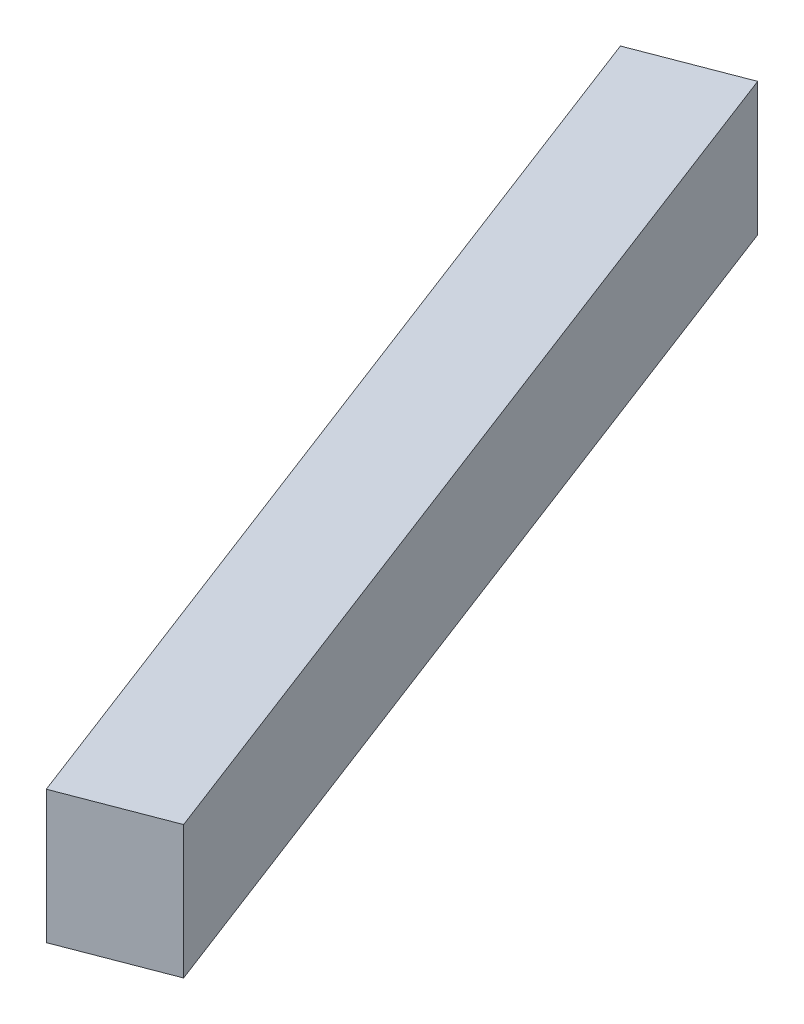
ISO-10303-21;
HEADER;
FILE_DESCRIPTION(('STEP AP214'),'2;1');
FILE_NAME('part.step','',(''),(''),'','','');
FILE_SCHEMA(('AUTOMOTIVE_DESIGN { 1 0 10303 214 1 1 1 1 }'));
ENDSEC;
DATA;
#1=APPLICATION_CONTEXT('core data for automotive mechanical design processes');
#2=APPLICATION_PROTOCOL_DEFINITION('international standard','automotive_design',2000,#1);
#3=PRODUCT_CONTEXT('',#1,'mechanical');
#4=PRODUCT('Part','Part','',(#3));
#5=PRODUCT_RELATED_PRODUCT_CATEGORY('part','',(#4));
#6=PRODUCT_DEFINITION_FORMATION('','',#4);
#7=PRODUCT_DEFINITION_CONTEXT('part definition',#1,'design');
#8=PRODUCT_DEFINITION('design','',#6,#7);
#9=PRODUCT_DEFINITION_SHAPE('','',#8);
#10=(LENGTH_UNIT() NAMED_UNIT(*) SI_UNIT(.MILLI.,.METRE.));
#11=(NAMED_UNIT(*) PLANE_ANGLE_UNIT() SI_UNIT($,.RADIAN.));
#12=(NAMED_UNIT(*) SI_UNIT($,.STERADIAN.) SOLID_ANGLE_UNIT());
#13=UNCERTAINTY_MEASURE_WITH_UNIT(LENGTH_MEASURE(1.E-05),#10,'distance_accuracy_value','');
#14=(GEOMETRIC_REPRESENTATION_CONTEXT(3) GLOBAL_UNCERTAINTY_ASSIGNED_CONTEXT((#13)) GLOBAL_UNIT_ASSIGNED_CONTEXT((#10,
#11,#12)) REPRESENTATION_CONTEXT('',''));
#15=CARTESIAN_POINT('',(0.,0.,0.));
#16=DIRECTION('',(0.,0.,1.));
#17=DIRECTION('',(1.,0.,0.));
#18=AXIS2_PLACEMENT_3D('',#15,#16,#17);
#19=CARTESIAN_POINT('',(-6.53262142412865,7.874,-16.769580594442));
#20=DIRECTION('',(0.933801248386571,0.,-0.357792158259068));
#21=DIRECTION('',(-0.357792158259068,0.,-0.933801248386571));
#22=AXIS2_PLACEMENT_3D('',#19,#20,#21);
#23=PLANE('',#22);
#24=DIRECTION('',(0.,1.,0.));
#25=VECTOR('',#24,1.);
#26=CARTESIAN_POINT('',(-6.53262142412865,7.874,-16.769580594442));
#27=LINE('',#26,#25);
#28=CARTESIAN_POINT('',(-6.53262142412865,7.62,-16.769580594442));
#29=VERTEX_POINT('',#28);
#30=CARTESIAN_POINT('',(-6.53262142412865,7.874,-16.769580594442));
#31=VERTEX_POINT('',#30);
#32=EDGE_CURVE('E20',#29,#31,#27,.T.);
#33=ORIENTED_EDGE('',*,*,#32,.T.);
#34=DIRECTION('',(-0.357792158259069,0.,-0.93380124838657));
#35=VECTOR('',#34,1.);
#36=CARTESIAN_POINT('',(-6.53262142412865,7.874,-16.769580594442));
#37=LINE('',#36,#35);
#38=CARTESIAN_POINT('',(-7.21421548561217,7.874,-18.5484719726184));
#39=VERTEX_POINT('',#38);
#40=EDGE_CURVE('E55',#31,#39,#37,.T.);
#41=ORIENTED_EDGE('',*,*,#40,.T.);
#42=DIRECTION('',(0.,1.,0.));
#43=VECTOR('',#42,1.);
#44=CARTESIAN_POINT('',(-7.21421548561217,7.874,-18.5484719726184));
#45=LINE('',#44,#43);
#46=CARTESIAN_POINT('',(-7.21421548561217,7.62,-18.5484719726184));
#47=VERTEX_POINT('',#46);
#48=EDGE_CURVE('E76',#39,#47,#45,.F.);
#49=ORIENTED_EDGE('',*,*,#48,.T.);
#50=DIRECTION('',(-0.357792158259069,0.,-0.93380124838657));
#51=VECTOR('',#50,1.);
#52=CARTESIAN_POINT('',(-6.53262142412865,7.62,-16.769580594442));
#53=LINE('',#52,#51);
#54=EDGE_CURVE('E58',#29,#47,#53,.T.);
#55=ORIENTED_EDGE('',*,*,#54,.F.);
#56=EDGE_LOOP('',(#33,#41,#49,#55));
#57=FACE_BOUND('',#56,.T.);
#58=ADVANCED_FACE('F17',(#57),#23,.F.);
#59=CARTESIAN_POINT('',(-6.53262142412865,7.874,-16.769580594442));
#60=DIRECTION('',(-0.357792158259112,0.,-0.933801248386554));
#61=DIRECTION('',(-0.933801248386554,0.,0.357792158259112));
#62=AXIS2_PLACEMENT_3D('',#59,#60,#61);
#63=PLANE('',#62);
#64=DIRECTION('',(0.,1.,0.));
#65=VECTOR('',#64,1.);
#66=CARTESIAN_POINT('',(-6.3428730104565,7.874,-16.8422839610003));
#67=LINE('',#66,#65);
#68=CARTESIAN_POINT('',(-6.34287301045649,7.62,-16.8422839610003));
#69=VERTEX_POINT('',#68);
#70=CARTESIAN_POINT('',(-6.34287301045649,7.874,-16.8422839610003));
#71=VERTEX_POINT('',#70);
#72=EDGE_CURVE('E73',#69,#71,#67,.T.);
#73=ORIENTED_EDGE('',*,*,#72,.T.);
#74=DIRECTION('',(-0.933801248386473,0.,0.357792158259322));
#75=VECTOR('',#74,1.);
#76=CARTESIAN_POINT('',(-6.3428730104565,7.874,-16.8422839610003));
#77=LINE('',#76,#75);
#78=EDGE_CURVE('E63',#71,#31,#77,.T.);
#79=ORIENTED_EDGE('',*,*,#78,.T.);
#80=ORIENTED_EDGE('',*,*,#32,.F.);
#81=DIRECTION('',(-0.933801248386473,0.,0.357792158259322));
#82=VECTOR('',#81,1.);
#83=CARTESIAN_POINT('',(-6.3428730104565,7.62,-16.8422839610003));
#84=LINE('',#83,#82);
#85=EDGE_CURVE('E80',#69,#29,#84,.T.);
#86=ORIENTED_EDGE('',*,*,#85,.F.);
#87=EDGE_LOOP('',(#73,#79,#80,#86));
#88=FACE_BOUND('',#87,.T.);
#89=ADVANCED_FACE('F72',(#88),#63,.F.);
#90=CARTESIAN_POINT('',(-6.53262142412865,7.874,-16.769580594442));
#91=DIRECTION('',(0.,-1.,0.));
#92=DIRECTION('',(0.,0.,-1.));
#93=AXIS2_PLACEMENT_3D('',#90,#91,#92);
#94=PLANE('',#93);
#95=ORIENTED_EDGE('',*,*,#78,.F.);
#96=DIRECTION('',(0.357792158259069,0.,0.933801248386571));
#97=VECTOR('',#96,1.);
#98=CARTESIAN_POINT('',(-6.3428730104565,7.874,-16.8422839610003));
#99=LINE('',#98,#97);
#100=CARTESIAN_POINT('',(-7.02446707205069,7.874,-18.6211753394655));
#101=VERTEX_POINT('',#100);
#102=EDGE_CURVE('E83',#71,#101,#99,.F.);
#103=ORIENTED_EDGE('',*,*,#102,.T.);
#104=DIRECTION('',(0.933801247841896,0.,-0.357792159680614));
#105=VECTOR('',#104,1.);
#106=CARTESIAN_POINT('',(-7.21421548561217,7.874,-18.5484719726184));
#107=LINE('',#106,#105);
#108=EDGE_CURVE('E69',#101,#39,#107,.F.);
#109=ORIENTED_EDGE('',*,*,#108,.T.);
#110=ORIENTED_EDGE('',*,*,#40,.F.);
#111=EDGE_LOOP('',(#95,#103,#109,#110));
#112=FACE_BOUND('',#111,.T.);
#113=ADVANCED_FACE('F66',(#112),#94,.F.);
#114=CARTESIAN_POINT('',(-7.21421548561217,7.874,-18.5484719726184));
#115=DIRECTION('',(0.357792159680614,0.,0.933801247841896));
#116=DIRECTION('',(0.933801247841896,0.,-0.357792159680614));
#117=AXIS2_PLACEMENT_3D('',#114,#115,#116);
#118=PLANE('',#117);
#119=ORIENTED_EDGE('',*,*,#48,.F.);
#120=ORIENTED_EDGE('',*,*,#108,.F.);
#121=DIRECTION('',(0.,1.,0.));
#122=VECTOR('',#121,1.);
#123=CARTESIAN_POINT('',(-7.02446707205068,7.874,-18.6211753394655));
#124=LINE('',#123,#122);
#125=CARTESIAN_POINT('',(-7.02446707205069,7.62,-18.6211753394655));
#126=VERTEX_POINT('',#125);
#127=EDGE_CURVE('E26',#101,#126,#124,.F.);
#128=ORIENTED_EDGE('',*,*,#127,.T.);
#129=DIRECTION('',(0.93380124784191,0.,-0.357792159680577));
#130=VECTOR('',#129,1.);
#131=CARTESIAN_POINT('',(-7.21421548561217,7.62,-18.5484719726184));
#132=LINE('',#131,#130);
#133=EDGE_CURVE('E34',#47,#126,#132,.T.);
#134=ORIENTED_EDGE('',*,*,#133,.F.);
#135=EDGE_LOOP('',(#119,#120,#128,#134));
#136=FACE_BOUND('',#135,.T.);
#137=ADVANCED_FACE('F88',(#136),#118,.F.);
#138=CARTESIAN_POINT('',(-6.53262142412865,7.62,-16.769580594442));
#139=DIRECTION('',(0.,-1.,0.));
#140=DIRECTION('',(0.,0.,-1.));
#141=AXIS2_PLACEMENT_3D('',#138,#139,#140);
#142=PLANE('',#141);
#143=DIRECTION('',(0.357792158259069,0.,0.933801248386571));
#144=VECTOR('',#143,1.);
#145=CARTESIAN_POINT('',(-6.3428730104565,7.62,-16.8422839610003));
#146=LINE('',#145,#144);
#147=EDGE_CURVE('E11',#126,#69,#146,.T.);
#148=ORIENTED_EDGE('',*,*,#147,.T.);
#149=ORIENTED_EDGE('',*,*,#85,.T.);
#150=ORIENTED_EDGE('',*,*,#54,.T.);
#151=ORIENTED_EDGE('',*,*,#133,.T.);
#152=EDGE_LOOP('',(#148,#149,#150,#151));
#153=FACE_BOUND('',#152,.T.);
#154=ADVANCED_FACE('F91',(#153),#142,.T.);
#155=CARTESIAN_POINT('',(-6.3428730104565,7.874,-16.8422839610003));
#156=DIRECTION('',(-0.933801248386571,0.,0.357792158259069));
#157=DIRECTION('',(0.357792158259069,0.,0.933801248386571));
#158=AXIS2_PLACEMENT_3D('',#155,#156,#157);
#159=PLANE('',#158);
#160=ORIENTED_EDGE('',*,*,#127,.F.);
#161=ORIENTED_EDGE('',*,*,#102,.F.);
#162=ORIENTED_EDGE('',*,*,#72,.F.);
#163=ORIENTED_EDGE('',*,*,#147,.F.);
#164=EDGE_LOOP('',(#160,#161,#162,#163));
#165=FACE_BOUND('',#164,.T.);
#166=ADVANCED_FACE('F90',(#165),#159,.F.);
#167=CLOSED_SHELL('',(#58,#89,#113,#137,#154,#166));
#168=MANIFOLD_SOLID_BREP('B1',#167);
#169=ADVANCED_BREP_SHAPE_REPRESENTATION('',(#18,#168),#14);
#170=SHAPE_DEFINITION_REPRESENTATION(#9,#169);
ENDSEC;
END-ISO-10303-21;
